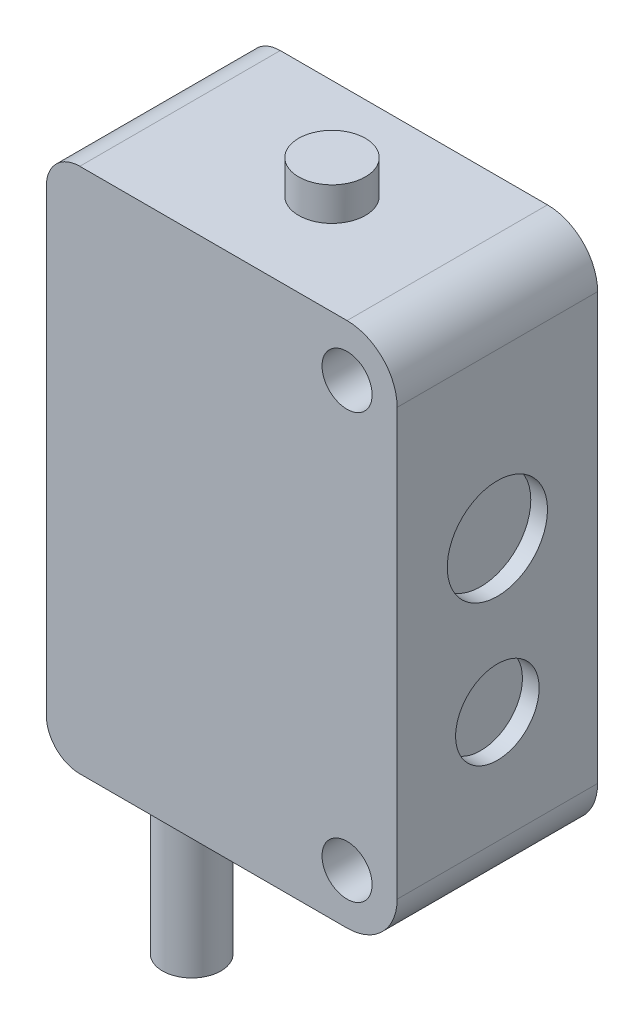
ISO-10303-21;
HEADER;
FILE_DESCRIPTION(('STEP AP214'),'2;1');
FILE_NAME('part.step','',(''),(''),'','','');
FILE_SCHEMA(('AUTOMOTIVE_DESIGN { 1 0 10303 214 1 1 1 1 }'));
ENDSEC;
DATA;
#1=APPLICATION_CONTEXT('core data for automotive mechanical design processes');
#2=APPLICATION_PROTOCOL_DEFINITION('international standard','automotive_design',2000,#1);
#3=PRODUCT_CONTEXT('',#1,'mechanical');
#4=PRODUCT('Part','Part','',(#3));
#5=PRODUCT_RELATED_PRODUCT_CATEGORY('part','',(#4));
#6=PRODUCT_DEFINITION_FORMATION('','',#4);
#7=PRODUCT_DEFINITION_CONTEXT('part definition',#1,'design');
#8=PRODUCT_DEFINITION('design','',#6,#7);
#9=PRODUCT_DEFINITION_SHAPE('','',#8);
#10=(LENGTH_UNIT() NAMED_UNIT(*) SI_UNIT(.MILLI.,.METRE.));
#11=(NAMED_UNIT(*) PLANE_ANGLE_UNIT() SI_UNIT($,.RADIAN.));
#12=(NAMED_UNIT(*) SI_UNIT($,.STERADIAN.) SOLID_ANGLE_UNIT());
#13=UNCERTAINTY_MEASURE_WITH_UNIT(LENGTH_MEASURE(1.E-05),#10,'distance_accuracy_value','');
#14=(GEOMETRIC_REPRESENTATION_CONTEXT(3) GLOBAL_UNCERTAINTY_ASSIGNED_CONTEXT((#13)) GLOBAL_UNIT_ASSIGNED_CONTEXT((#10,
#11,#12)) REPRESENTATION_CONTEXT('',''));
#15=CARTESIAN_POINT('',(0.,0.,0.));
#16=DIRECTION('',(0.,0.,1.));
#17=DIRECTION('',(1.,0.,0.));
#18=AXIS2_PLACEMENT_3D('',#15,#16,#17);
#19=CARTESIAN_POINT('',(0.,0.,12.));
#20=DIRECTION('',(0.,0.,-1.));
#21=DIRECTION('',(-1.,0.,0.));
#22=AXIS2_PLACEMENT_3D('',#19,#20,#21);
#23=PLANE('',#22);
#24=DIRECTION('',(0.,-1.,0.));
#25=VECTOR('',#24,1.);
#26=CARTESIAN_POINT('',(0.,0.,12.));
#27=LINE('',#26,#25);
#28=CARTESIAN_POINT('',(0.,29.5,12.));
#29=VERTEX_POINT('',#28);
#30=CARTESIAN_POINT('',(0.,2.,12.));
#31=VERTEX_POINT('',#30);
#32=EDGE_CURVE('E241',#29,#31,#27,.T.);
#33=ORIENTED_EDGE('',*,*,#32,.T.);
#34=CARTESIAN_POINT('',(2.,2.,12.));
#35=DIRECTION('',(0.,0.,-1.));
#36=DIRECTION('',(-1.,0.,0.));
#37=AXIS2_PLACEMENT_3D('',#34,#35,#36);
#38=CIRCLE('',#37,2.);
#39=CARTESIAN_POINT('',(2.,0.,12.));
#40=VERTEX_POINT('',#39);
#41=EDGE_CURVE('E49',#31,#40,#38,.F.);
#42=ORIENTED_EDGE('',*,*,#41,.T.);
#43=DIRECTION('',(1.,0.,0.));
#44=VECTOR('',#43,1.);
#45=CARTESIAN_POINT('',(0.,0.,12.));
#46=LINE('',#45,#44);
#47=CARTESIAN_POINT('',(18.,0.,12.));
#48=VERTEX_POINT('',#47);
#49=EDGE_CURVE('E155',#40,#48,#46,.T.);
#50=ORIENTED_EDGE('',*,*,#49,.T.);
#51=CARTESIAN_POINT('',(18.,3.,12.));
#52=DIRECTION('',(0.,0.,-1.));
#53=DIRECTION('',(-1.,0.,0.));
#54=AXIS2_PLACEMENT_3D('',#51,#52,#53);
#55=CIRCLE('',#54,3.);
#56=CARTESIAN_POINT('',(21.,3.,12.));
#57=VERTEX_POINT('',#56);
#58=EDGE_CURVE('E173',#48,#57,#55,.F.);
#59=ORIENTED_EDGE('',*,*,#58,.T.);
#60=DIRECTION('',(0.,1.,0.));
#61=VECTOR('',#60,1.);
#62=CARTESIAN_POINT('',(21.,0.,12.));
#63=LINE('',#62,#61);
#64=CARTESIAN_POINT('',(21.,28.5,12.));
#65=VERTEX_POINT('',#64);
#66=EDGE_CURVE('E140',#57,#65,#63,.T.);
#67=ORIENTED_EDGE('',*,*,#66,.T.);
#68=CARTESIAN_POINT('',(18.,28.5,12.));
#69=DIRECTION('',(0.,0.,-1.));
#70=DIRECTION('',(-1.,0.,0.));
#71=AXIS2_PLACEMENT_3D('',#68,#69,#70);
#72=CIRCLE('',#71,3.);
#73=CARTESIAN_POINT('',(18.,31.5,12.));
#74=VERTEX_POINT('',#73);
#75=EDGE_CURVE('E171',#65,#74,#72,.F.);
#76=ORIENTED_EDGE('',*,*,#75,.T.);
#77=DIRECTION('',(-1.,0.,0.));
#78=VECTOR('',#77,1.);
#79=CARTESIAN_POINT('',(0.,31.5,12.));
#80=LINE('',#79,#78);
#81=CARTESIAN_POINT('',(2.,31.5,12.));
#82=VERTEX_POINT('',#81);
#83=EDGE_CURVE('E243',#74,#82,#80,.T.);
#84=ORIENTED_EDGE('',*,*,#83,.T.);
#85=CARTESIAN_POINT('',(2.,29.5,12.));
#86=DIRECTION('',(0.,0.,-1.));
#87=DIRECTION('',(-1.,0.,0.));
#88=AXIS2_PLACEMENT_3D('',#85,#86,#87);
#89=CIRCLE('',#88,2.);
#90=EDGE_CURVE('E235',#82,#29,#89,.F.);
#91=ORIENTED_EDGE('',*,*,#90,.T.);
#92=EDGE_LOOP('',(#33,#42,#50,#59,#67,#76,#84,#91));
#93=FACE_BOUND('',#92,.T.);
#94=CARTESIAN_POINT('',(18.,28.4,12.));
#95=DIRECTION('',(0.,0.,1.));
#96=DIRECTION('',(1.,0.,0.));
#97=AXIS2_PLACEMENT_3D('',#94,#95,#96);
#98=CIRCLE('',#97,1.5);
#99=CARTESIAN_POINT('',(19.5,28.4,12.));
#100=VERTEX_POINT('',#99);
#101=EDGE_CURVE('E147',#100,#100,#98,.T.);
#102=ORIENTED_EDGE('',*,*,#101,.F.);
#103=EDGE_LOOP('',(#102));
#104=FACE_BOUND('',#103,.T.);
#105=CARTESIAN_POINT('',(18.,3.,12.));
#106=DIRECTION('',(0.,0.,1.));
#107=DIRECTION('',(1.,0.,0.));
#108=AXIS2_PLACEMENT_3D('',#105,#106,#107);
#109=CIRCLE('',#108,1.5);
#110=CARTESIAN_POINT('',(19.5,3.,12.));
#111=VERTEX_POINT('',#110);
#112=EDGE_CURVE('E256',#111,#111,#109,.T.);
#113=ORIENTED_EDGE('',*,*,#112,.F.);
#114=EDGE_LOOP('',(#113));
#115=FACE_BOUND('',#114,.T.);
#116=ADVANCED_FACE('F35',(#93,#104,#115),#23,.F.);
#117=CARTESIAN_POINT('',(0.,0.,0.));
#118=DIRECTION('',(0.,0.,-1.));
#119=DIRECTION('',(-1.,0.,0.));
#120=AXIS2_PLACEMENT_3D('',#117,#118,#119);
#121=PLANE('',#120);
#122=CARTESIAN_POINT('',(18.,28.4,0.));
#123=DIRECTION('',(0.,0.,1.));
#124=DIRECTION('',(1.,0.,0.));
#125=AXIS2_PLACEMENT_3D('',#122,#123,#124);
#126=CIRCLE('',#125,1.5);
#127=CARTESIAN_POINT('',(19.5,28.4,0.));
#128=VERTEX_POINT('',#127);
#129=EDGE_CURVE('E152',#128,#128,#126,.T.);
#130=ORIENTED_EDGE('',*,*,#129,.T.);
#131=EDGE_LOOP('',(#130));
#132=FACE_BOUND('',#131,.T.);
#133=DIRECTION('',(1.,0.,0.));
#134=VECTOR('',#133,1.);
#135=CARTESIAN_POINT('',(0.,0.,0.));
#136=LINE('',#135,#134);
#137=CARTESIAN_POINT('',(2.,0.,0.));
#138=VERTEX_POINT('',#137);
#139=CARTESIAN_POINT('',(18.,0.,0.));
#140=VERTEX_POINT('',#139);
#141=EDGE_CURVE('E159',#138,#140,#136,.T.);
#142=ORIENTED_EDGE('',*,*,#141,.F.);
#143=CARTESIAN_POINT('',(2.,2.,0.));
#144=DIRECTION('',(0.,0.,-1.));
#145=DIRECTION('',(-1.,0.,0.));
#146=AXIS2_PLACEMENT_3D('',#143,#144,#145);
#147=CIRCLE('',#146,2.);
#148=CARTESIAN_POINT('',(0.,2.,0.));
#149=VERTEX_POINT('',#148);
#150=EDGE_CURVE('E185',#138,#149,#147,.T.);
#151=ORIENTED_EDGE('',*,*,#150,.T.);
#152=DIRECTION('',(0.,-1.,0.));
#153=VECTOR('',#152,1.);
#154=CARTESIAN_POINT('',(0.,0.,0.));
#155=LINE('',#154,#153);
#156=CARTESIAN_POINT('',(0.,29.5,0.));
#157=VERTEX_POINT('',#156);
#158=EDGE_CURVE('E149',#157,#149,#155,.T.);
#159=ORIENTED_EDGE('',*,*,#158,.F.);
#160=CARTESIAN_POINT('',(2.,29.5,0.));
#161=DIRECTION('',(0.,0.,-1.));
#162=DIRECTION('',(-1.,0.,0.));
#163=AXIS2_PLACEMENT_3D('',#160,#161,#162);
#164=CIRCLE('',#163,2.);
#165=CARTESIAN_POINT('',(2.,31.5,0.));
#166=VERTEX_POINT('',#165);
#167=EDGE_CURVE('E183',#157,#166,#164,.T.);
#168=ORIENTED_EDGE('',*,*,#167,.T.);
#169=DIRECTION('',(-1.,0.,0.));
#170=VECTOR('',#169,1.);
#171=CARTESIAN_POINT('',(0.,31.5,0.));
#172=LINE('',#171,#170);
#173=CARTESIAN_POINT('',(18.,31.5,0.));
#174=VERTEX_POINT('',#173);
#175=EDGE_CURVE('E146',#174,#166,#172,.T.);
#176=ORIENTED_EDGE('',*,*,#175,.F.);
#177=CARTESIAN_POINT('',(18.,28.5,0.));
#178=DIRECTION('',(0.,0.,-1.));
#179=DIRECTION('',(-1.,0.,0.));
#180=AXIS2_PLACEMENT_3D('',#177,#178,#179);
#181=CIRCLE('',#180,3.);
#182=CARTESIAN_POINT('',(21.,28.5,0.));
#183=VERTEX_POINT('',#182);
#184=EDGE_CURVE('E131',#174,#183,#181,.T.);
#185=ORIENTED_EDGE('',*,*,#184,.T.);
#186=DIRECTION('',(0.,1.,0.));
#187=VECTOR('',#186,1.);
#188=CARTESIAN_POINT('',(21.,0.,0.));
#189=LINE('',#188,#187);
#190=CARTESIAN_POINT('',(21.,3.,0.));
#191=VERTEX_POINT('',#190);
#192=EDGE_CURVE('E137',#191,#183,#189,.T.);
#193=ORIENTED_EDGE('',*,*,#192,.F.);
#194=CARTESIAN_POINT('',(18.,3.,0.));
#195=DIRECTION('',(0.,0.,-1.));
#196=DIRECTION('',(-1.,0.,0.));
#197=AXIS2_PLACEMENT_3D('',#194,#195,#196);
#198=CIRCLE('',#197,3.);
#199=EDGE_CURVE('E121',#191,#140,#198,.T.);
#200=ORIENTED_EDGE('',*,*,#199,.T.);
#201=EDGE_LOOP('',(#142,#151,#159,#168,#176,#185,#193,#200));
#202=FACE_BOUND('',#201,.T.);
#203=CARTESIAN_POINT('',(18.,3.,0.));
#204=DIRECTION('',(0.,0.,1.));
#205=DIRECTION('',(1.,0.,0.));
#206=AXIS2_PLACEMENT_3D('',#203,#204,#205);
#207=CIRCLE('',#206,1.5);
#208=CARTESIAN_POINT('',(19.5,3.,0.));
#209=VERTEX_POINT('',#208);
#210=EDGE_CURVE('E258',#209,#209,#207,.T.);
#211=ORIENTED_EDGE('',*,*,#210,.T.);
#212=EDGE_LOOP('',(#211));
#213=FACE_BOUND('',#212,.T.);
#214=ADVANCED_FACE('F143',(#132,#202,#213),#121,.T.);
#215=CARTESIAN_POINT('',(21.,0.,12.));
#216=DIRECTION('',(-1.,0.,0.));
#217=DIRECTION('',(0.,0.,1.));
#218=AXIS2_PLACEMENT_3D('',#215,#216,#217);
#219=PLANE('',#218);
#220=CARTESIAN_POINT('',(21.,18.7,6.));
#221=DIRECTION('',(1.,0.,0.));
#222=DIRECTION('',(0.,0.,-1.));
#223=AXIS2_PLACEMENT_3D('',#220,#221,#222);
#224=CIRCLE('',#223,3.);
#225=CARTESIAN_POINT('',(21.,18.7,3.));
#226=VERTEX_POINT('',#225);
#227=EDGE_CURVE('E273',#226,#226,#224,.T.);
#228=ORIENTED_EDGE('',*,*,#227,.F.);
#229=EDGE_LOOP('',(#228));
#230=FACE_BOUND('',#229,.T.);
#231=CARTESIAN_POINT('',(21.,9.7,6.));
#232=DIRECTION('',(1.,0.,0.));
#233=DIRECTION('',(0.,0.,-1.));
#234=AXIS2_PLACEMENT_3D('',#231,#232,#233);
#235=CIRCLE('',#234,2.5);
#236=CARTESIAN_POINT('',(21.,9.7,3.5));
#237=VERTEX_POINT('',#236);
#238=EDGE_CURVE('E267',#237,#237,#235,.T.);
#239=ORIENTED_EDGE('',*,*,#238,.F.);
#240=EDGE_LOOP('',(#239));
#241=FACE_BOUND('',#240,.T.);
#242=ORIENTED_EDGE('',*,*,#66,.F.);
#243=DIRECTION('',(0.,0.,-1.));
#244=VECTOR('',#243,1.);
#245=CARTESIAN_POINT('',(21.,3.,12.));
#246=LINE('',#245,#244);
#247=EDGE_CURVE('E125',#57,#191,#246,.T.);
#248=ORIENTED_EDGE('',*,*,#247,.T.);
#249=ORIENTED_EDGE('',*,*,#192,.T.);
#250=DIRECTION('',(0.,0.,-1.));
#251=VECTOR('',#250,1.);
#252=CARTESIAN_POINT('',(21.,28.5,12.));
#253=LINE('',#252,#251);
#254=EDGE_CURVE('E141',#183,#65,#253,.F.);
#255=ORIENTED_EDGE('',*,*,#254,.T.);
#256=EDGE_LOOP('',(#242,#248,#249,#255));
#257=FACE_BOUND('',#256,.T.);
#258=ADVANCED_FACE('F136',(#230,#241,#257),#219,.F.);
#259=CARTESIAN_POINT('',(0.,31.5,12.));
#260=DIRECTION('',(0.,-1.,0.));
#261=DIRECTION('',(0.,0.,-1.));
#262=AXIS2_PLACEMENT_3D('',#259,#260,#261);
#263=PLANE('',#262);
#264=CARTESIAN_POINT('',(11.1,31.5,6.));
#265=DIRECTION('',(0.,-1.,0.));
#266=DIRECTION('',(0.,0.,-1.));
#267=AXIS2_PLACEMENT_3D('',#264,#265,#266);
#268=CIRCLE('',#267,2.);
#269=CARTESIAN_POINT('',(11.1,31.5,4.));
#270=VERTEX_POINT('',#269);
#271=EDGE_CURVE('E164',#270,#270,#268,.F.);
#272=ORIENTED_EDGE('',*,*,#271,.F.);
#273=EDGE_LOOP('',(#272));
#274=FACE_BOUND('',#273,.T.);
#275=ORIENTED_EDGE('',*,*,#175,.T.);
#276=DIRECTION('',(0.,0.,-1.));
#277=VECTOR('',#276,1.);
#278=CARTESIAN_POINT('',(2.,31.5,12.));
#279=LINE('',#278,#277);
#280=EDGE_CURVE('E11',#166,#82,#279,.F.);
#281=ORIENTED_EDGE('',*,*,#280,.T.);
#282=ORIENTED_EDGE('',*,*,#83,.F.);
#283=DIRECTION('',(0.,0.,-1.));
#284=VECTOR('',#283,1.);
#285=CARTESIAN_POINT('',(18.,31.5,12.));
#286=LINE('',#285,#284);
#287=EDGE_CURVE('E175',#74,#174,#286,.T.);
#288=ORIENTED_EDGE('',*,*,#287,.T.);
#289=EDGE_LOOP('',(#275,#281,#282,#288));
#290=FACE_BOUND('',#289,.T.);
#291=ADVANCED_FACE('F248',(#274,#290),#263,.F.);
#292=CARTESIAN_POINT('',(0.,0.,12.));
#293=DIRECTION('',(1.,0.,0.));
#294=DIRECTION('',(0.,0.,-1.));
#295=AXIS2_PLACEMENT_3D('',#292,#293,#294);
#296=PLANE('',#295);
#297=ORIENTED_EDGE('',*,*,#158,.T.);
#298=DIRECTION('',(0.,0.,-1.));
#299=VECTOR('',#298,1.);
#300=CARTESIAN_POINT('',(0.,2.,12.));
#301=LINE('',#300,#299);
#302=CARTESIAN_POINT('',(0.,2.,4.39609850676546));
#303=VERTEX_POINT('',#302);
#304=EDGE_CURVE('E63',#149,#303,#301,.F.);
#305=ORIENTED_EDGE('',*,*,#304,.T.);
#306=CARTESIAN_POINT('',(0.,1.93683512249513,8.13693880979573));
#307=CARTESIAN_POINT('',(0.,-0.162980398312273,7.62317124403445));
#308=CARTESIAN_POINT('',(2.15523306375944,0.,7.66304810068112));
#309=CARTESIAN_POINT('',(0.,1.95084203062787,8.0797382134936));
#310=CARTESIAN_POINT('',(0.,-0.149224251738284,7.62692735632381));
#311=CARTESIAN_POINT('',(2.14204816993278,0.,7.65870877024948));
#312=CARTESIAN_POINT('',(0.,1.96247152150819,8.0219686936225));
#313=CARTESIAN_POINT('',(0.,-0.134043421859367,7.62924692475699));
#314=CARTESIAN_POINT('',(2.12785936482586,0.,7.65390588171876));
#315=CARTESIAN_POINT('',(0.,1.98106174806458,7.90571413975154));
#316=CARTESIAN_POINT('',(0.,-0.10098777342364,7.62999862115966));
#317=CARTESIAN_POINT('',(2.09700608542803,0.,7.64291967770616));
#318=CARTESIAN_POINT('',(0.,1.98802507199702,7.84722952077024));
#319=CARTESIAN_POINT('',(0.,-0.0831562949717819,7.62846392259803));
#320=CARTESIAN_POINT('',(2.08034298986759,0.,7.63673713004285));
#321=CARTESIAN_POINT('',(0.,1.99730586191494,7.73088716262242));
#322=CARTESIAN_POINT('',(0.,-0.0452677011130535,7.62070634601689));
#323=CARTESIAN_POINT('',(2.0443641373133,0.,7.62265365957321));
#324=CARTESIAN_POINT('',(0.,1.99969932959627,7.67303537330214));
#325=CARTESIAN_POINT('',(0.,-0.0253038167997787,7.61461058769533));
#326=CARTESIAN_POINT('',(2.02509758731116,0.,7.61478331402946));
#327=CARTESIAN_POINT('',(0.,2.00024721882129,7.55731735269524));
#328=CARTESIAN_POINT('',(0.,0.0168424976905548,7.59682306955048));
#329=CARTESIAN_POINT('',(1.98312532283197,0.,7.59659591175098));
#330=CARTESIAN_POINT('',(0.,1.99840180947869,7.49945112207685));
#331=CARTESIAN_POINT('',(0.,0.0389692347504988,7.58520346365664));
#332=CARTESIAN_POINT('',(1.96041974559167,0.,7.58627895264076));
#333=CARTESIAN_POINT('',(0.,1.99135045805174,7.39331841843868));
#334=CARTESIAN_POINT('',(0.,0.0814143335320806,7.55761526044668));
#335=CARTESIAN_POINT('',(1.91488554674234,0.,7.56416965272015));
#336=CARTESIAN_POINT('',(0.,1.98673538166484,7.34501088267696));
#337=CARTESIAN_POINT('',(0.,0.101372507363181,7.54274307059891));
#338=CARTESIAN_POINT('',(1.89266902297064,0.,7.55288468434869));
#339=CARTESIAN_POINT('',(0.,1.97491507186992,7.24870958351748));
#340=CARTESIAN_POINT('',(0.,0.142336594281262,7.50748492721466));
#341=CARTESIAN_POINT('',(1.844869753425,0.,7.52708652995679));
#342=CARTESIAN_POINT('',(0.,1.96770947880233,7.20071586463165));
#343=CARTESIAN_POINT('',(0.,0.163302928340936,7.48718354114414));
#344=CARTESIAN_POINT('',(1.81928654054286,0.,7.5125728957848));
#345=CARTESIAN_POINT('',(0.,1.95088501107582,7.1045937690975));
#346=CARTESIAN_POINT('',(0.,0.206176737277261,7.43991630460445));
#347=CARTESIAN_POINT('',(1.76396034274313,0.,7.47898327196881));
#348=CARTESIAN_POINT('',(0.,1.94123952927082,7.05647010835317));
#349=CARTESIAN_POINT('',(0.,0.228053733574999,7.4129906710132));
#350=CARTESIAN_POINT('',(1.7341732100554,0.,7.45985709712815));
#351=CARTESIAN_POINT('',(0.,1.91995503473011,6.9607107998852));
#352=CARTESIAN_POINT('',(0.,0.272057086634414,7.35156003582039));
#353=CARTESIAN_POINT('',(1.67023016891106,0.,7.41548533626005));
#354=CARTESIAN_POINT('',(0.,1.90831757849187,6.91307480167924));
#355=CARTESIAN_POINT('',(0.,0.294144204413786,7.3172144742904));
#356=CARTESIAN_POINT('',(1.63607767671495,0.,7.39024452176878));
#357=CARTESIAN_POINT('',(0.,1.88689589873724,6.83104134047631));
#358=CARTESIAN_POINT('',(0.,0.332142065579762,7.25007110863834));
#359=CARTESIAN_POINT('',(1.57303034728235,0.,7.33925358153134));
#360=CARTESIAN_POINT('',(0.,1.87746266414338,6.79655057207412));
#361=CARTESIAN_POINT('',(0.,0.348035896113425,7.21955948637963));
#362=CARTESIAN_POINT('',(1.54521456016237,0.,7.3154905647449));
#363=CARTESIAN_POINT('',(0.,1.85805183757475,6.7277221403963));
#364=CARTESIAN_POINT('',(0.,0.37936999684075,7.15336199139034));
#365=CARTESIAN_POINT('',(1.48722326059413,0.,7.26223116729388));
#366=CARTESIAN_POINT('',(0.,1.84807422342467,6.69338448341939));
#367=CARTESIAN_POINT('',(0.,0.394803966414087,7.11775993626065));
#368=CARTESIAN_POINT('',(1.45704765199682,0.,7.23273455294559));
#369=CARTESIAN_POINT('',(0.,1.82786373644973,6.62466598326665));
#370=CARTESIAN_POINT('',(0.,0.424929693634334,7.04073060673822));
#371=CARTESIAN_POINT('',(1.39461887657728,0.,7.16643125013527));
#372=CARTESIAN_POINT('',(0.,1.81763014879354,6.59028535367346));
#373=CARTESIAN_POINT('',(0.,0.439620832385237,6.99937326510576));
#374=CARTESIAN_POINT('',(1.36235936885051,0.,7.12960146499481));
#375=CARTESIAN_POINT('',(0.,1.79735812090225,6.52146447483049));
#376=CARTESIAN_POINT('',(0.,0.467795368528807,6.91040621042014));
#377=CARTESIAN_POINT('',(1.29673848011059,0.,7.0469681751789));
#378=CARTESIAN_POINT('',(0.,1.78731968642384,6.48702422385452));
#379=CARTESIAN_POINT('',(0.,0.481290854241388,6.86288020507471));
#380=CARTESIAN_POINT('',(1.26337706667127,0.,7.00116440622685));
#381=CARTESIAN_POINT('',(0.,1.7682491471883,6.41888484445113));
#382=CARTESIAN_POINT('',(0.,0.506224366042147,6.76259816149166));
#383=CARTESIAN_POINT('',(1.19815291700798,0.,6.90025533941929));
#384=CARTESIAN_POINT('',(0.,1.75919692671913,6.3851914652251));
#385=CARTESIAN_POINT('',(0.,0.51772874518155,6.71009119172052));
#386=CARTESIAN_POINT('',(1.16627422153017,0.,6.84544133864956));
#387=CARTESIAN_POINT('',(0.,1.74242172812538,6.31746359126593));
#388=CARTESIAN_POINT('',(0.,0.538565779985405,6.59882255356499));
#389=CARTESIAN_POINT('',(1.10560715938834,0.,6.72455035028512));
#390=CARTESIAN_POINT('',(0.,1.73469883898704,6.28342907385803));
#391=CARTESIAN_POINT('',(0.,0.54793399556314,6.54005697070651));
#392=CARTESIAN_POINT('',(1.07681899965516,0.,6.65847260927765));
#393=CARTESIAN_POINT('',(0.,1.72136475332657,6.21518684770821));
#394=CARTESIAN_POINT('',(0.,0.563826085879989,6.41739152662941));
#395=CARTESIAN_POINT('',(1.02605303486045,0.,6.51581351190814));
#396=CARTESIAN_POINT('',(0.,1.71573883221106,6.1809821240779));
#397=CARTESIAN_POINT('',(0.,0.57041119974274,6.35344040914854));
#398=CARTESIAN_POINT('',(1.00402794096692,0.,6.43931075348337));
#399=CARTESIAN_POINT('',(0.,1.70722168049796,6.1122362354827));
#400=CARTESIAN_POINT('',(0.,0.58027003759696,6.22178147193234));
#401=CARTESIAN_POINT('',(0.970300622961627,0.,6.27816764360119));
#402=CARTESIAN_POINT('',(0.,1.70432904987519,6.07769525192454));
#403=CARTESIAN_POINT('',(0.,0.583580862240164,6.15386982749307));
#404=CARTESIAN_POINT('',(0.95859311426237,0.,6.19353148267578));
#405=CARTESIAN_POINT('',(0.,1.70167227842998,6.00740549182217));
#406=CARTESIAN_POINT('',(0.,0.586611140832069,6.01489077298947));
#407=CARTESIAN_POINT('',(0.947854465277183,0.,6.01882915390054));
#408=CARTESIAN_POINT('',(0.,1.70200863570395,5.97165267675082));
#409=CARTESIAN_POINT('',(0.,0.586228790317255,5.9434779179584));
#410=CARTESIAN_POINT('',(0.949230521684976,0.,5.92867595480163));
#411=CARTESIAN_POINT('',(0.,1.70599629972429,5.90032930163099));
#412=CARTESIAN_POINT('',(0.,0.581672706900767,5.80297215830144));
#413=CARTESIAN_POINT('',(0.965311036193036,0.,5.75260869788773));
#414=CARTESIAN_POINT('',(0.,1.70964886083145,5.86475881566916));
#415=CARTESIAN_POINT('',(0.,0.577477446229539,5.73357709858112));
#416=CARTESIAN_POINT('',(0.98002053769249,0.,5.66669625711421));
#417=CARTESIAN_POINT('',(0.,1.71973621907862,5.79378076988645));
#418=CARTESIAN_POINT('',(0.,0.565735183040633,5.59928350702655));
#419=CARTESIAN_POINT('',(1.01965646820749,0.,5.50396395482519));
#420=CARTESIAN_POINT('',(0.,1.72619019383172,5.75837606475882));
#421=CARTESIAN_POINT('',(0.,0.558122434964903,5.53422134449718));
#422=CARTESIAN_POINT('',(1.0446532585134,0.,5.42721150243259));
#423=CARTESIAN_POINT('',(0.,1.74107651932383,5.68799352373587));
#424=CARTESIAN_POINT('',(0.,0.540201268821402,5.41045177047054));
#425=CARTESIAN_POINT('',(1.10059713590041,0.,5.28569680829759));
#426=CARTESIAN_POINT('',(0.,1.74950926787565,5.65301577516542));
#427=CARTESIAN_POINT('',(0.,0.529846641631659,5.351671400253));
#428=CARTESIAN_POINT('',(1.13154541924394,0.,5.22093698224363));
#429=CARTESIAN_POINT('',(0.,1.76784903467589,5.58231148656669));
#430=CARTESIAN_POINT('',(0.,0.506731600074812,5.23906283635057));
#431=CARTESIAN_POINT('',(1.19677621931281,0.,5.1013273314207));
#432=CARTESIAN_POINT('',(0.,1.77779333896229,5.54659488644956));
#433=CARTESIAN_POINT('',(0.,0.493873129836717,5.18548243753857));
#434=CARTESIAN_POINT('',(1.23113188917113,0.,5.04684239807566));
#435=CARTESIAN_POINT('',(0.,1.79824737418952,5.47533221186889));
#436=CARTESIAN_POINT('',(0.,0.466577035409689,5.08513894931369));
#437=CARTESIAN_POINT('',(1.29970218945688,0.,4.94869086102796));
#438=CARTESIAN_POINT('',(0.,1.80875703806014,5.4397861177203));
#439=CARTESIAN_POINT('',(0.,0.452116881248533,5.03845177503942));
#440=CARTESIAN_POINT('',(1.3339168360981,0.,4.90502297749775));
#441=CARTESIAN_POINT('',(0.,1.82976726092098,5.36880124222331));
#442=CARTESIAN_POINT('',(0.,0.422148104626759,4.95148497309558));
#443=CARTESIAN_POINT('',(1.40062320136226,0.,4.82664653025497));
#444=CARTESIAN_POINT('',(0.,1.84026776061726,5.33336244352801));
#445=CARTESIAN_POINT('',(0.,0.406633765201929,4.91128244009376));
#446=CARTESIAN_POINT('',(1.43311954875333,0.,4.79191280808474));
#447=CARTESIAN_POINT('',(0.,1.86087610170912,5.26236955840362));
#448=CARTESIAN_POINT('',(0.,0.374915361611927,4.83654358205906));
#449=CARTESIAN_POINT('',(1.49577625058735,0.,4.72944965700669));
#450=CARTESIAN_POINT('',(0.,1.87098394177592,5.22681547158483));
#451=CARTESIAN_POINT('',(0.,0.358713765974144,4.80210429954662));
#452=CARTESIAN_POINT('',(1.52593659712543,0.,4.70172025180033));
#453=CARTESIAN_POINT('',(0.,1.89122002473941,5.15283062842983));
#454=CARTESIAN_POINT('',(0.,0.324702679293544,4.73589801423996));
#455=CARTESIAN_POINT('',(1.58583029326059,0.,4.6498844343611));
#456=CARTESIAN_POINT('',(0.,1.90129274059407,5.11438444348386));
#457=CARTESIAN_POINT('',(0.,0.306891836067001,4.70466376273219));
#458=CARTESIAN_POINT('',(1.61536130202728,0.,4.62620676804727));
#459=CARTESIAN_POINT('',(0.,1.9203090792233,5.03721464729545));
#460=CARTESIAN_POINT('',(0.,0.271186736073723,4.64744355508599));
#461=CARTESIAN_POINT('',(1.67142807696692,0.,4.58375006536131));
#462=CARTESIAN_POINT('',(0.,1.92925270995505,4.99849103801018));
#463=CARTESIAN_POINT('',(0.,0.2533105938768,4.62155136607571));
#464=CARTESIAN_POINT('',(1.69796386424836,0.,4.56497099446564));
#465=CARTESIAN_POINT('',(0.,1.95403189602507,4.88180474047281));
#466=CARTESIAN_POINT('',(0.,0.199658678866084,4.55039604527521));
#467=CARTESIAN_POINT('',(1.77338065321428,0.,4.51419451684044));
#468=CARTESIAN_POINT('',(0.,1.96780013236835,4.8033808517092));
#469=CARTESIAN_POINT('',(0.,0.16460693095442,4.5129468378554));
#470=CARTESIAN_POINT('',(1.81802744890627,0.,4.48779240452168));
#471=CARTESIAN_POINT('',(0.,1.98825038943551,4.64703287166735));
#472=CARTESIAN_POINT('',(0.,0.0975624141781289,4.45301897587556));
#473=CARTESIAN_POINT('',(1.89735682975292,0.,4.44429741920541));
#474=CARTESIAN_POINT('',(0.,1.99505580149966,4.5691252994402));
#475=CARTESIAN_POINT('',(0.,0.0656842085043797,4.43064647856732));
#476=CARTESIAN_POINT('',(1.93220468594962,0.,4.42704515324868));
#477=CARTESIAN_POINT('',(0.,2.0011914878479,4.4130247453427));
#478=CARTESIAN_POINT('',(0.,0.00537854042024259,4.39691532209747));
#479=CARTESIAN_POINT('',(1.99489648632608,0.,4.39796365849501));
#480=CARTESIAN_POINT('',(0.,2.00052534947153,4.33483191845947));
#481=CARTESIAN_POINT('',(0.,-0.0229028643331489,4.38577576184849));
#482=CARTESIAN_POINT('',(2.0227437851399,0.,4.3861318300061));
#483=CARTESIAN_POINT('',(0.,1.99233851747381,4.19766660000934));
#484=CARTESIAN_POINT('',(0.,-0.0689231993130274,4.37374650690942));
#485=CARTESIAN_POINT('',(2.06693282823495,0.,4.36839412917208));
#486=CARTESIAN_POINT('',(0.,1.98650323077037,4.13859010264806));
#487=CARTESIAN_POINT('',(0.,-0.0875542900308317,4.3710893129277));
#488=CARTESIAN_POINT('',(2.0844313948271,0.,4.36174747469907));
#489=CARTESIAN_POINT('',(0.,1.97011091234765,4.02109843928029));
#490=CARTESIAN_POINT('',(0.,-0.122190478282109,4.36984014103016));
#491=CARTESIAN_POINT('',(2.11680389507901,0.,4.34994548830187));
#492=CARTESIAN_POINT('',(0.,1.95955464000915,3.96268316846287));
#493=CARTESIAN_POINT('',(0.,-0.138151274565492,4.37128322764624));
#494=CARTESIAN_POINT('',(2.13167825031248,0.,4.3447899167533));
#495=CARTESIAN_POINT('',(0.,1.93334699341654,3.84551487451842));
#496=CARTESIAN_POINT('',(0.,-0.167677351036985,4.37748283634278));
#497=CARTESIAN_POINT('',(2.15957711617309,0.,4.33546829863984));
#498=CARTESIAN_POINT('',(0.,1.91757834863925,3.78678797030475));
#499=CARTESIAN_POINT('',(0.,-0.181133528326475,4.3823403631083));
#500=CARTESIAN_POINT('',(2.17254806474417,0.,4.33132925877363));
#501=CARTESIAN_POINT('',(0.,1.88104075739081,3.67087293151112));
#502=CARTESIAN_POINT('',(0.,-0.205111495053921,4.39470977606579));
#503=CARTESIAN_POINT('',(2.19656597611647,0.,4.32393246636724));
#504=CARTESIAN_POINT('',(0.,1.86026875212785,3.61368576211343));
#505=CARTESIAN_POINT('',(0.,-0.215599774810105,4.40223471502393));
#506=CARTESIAN_POINT('',(2.20761175482251,0.,4.32067525552828));
#507=CARTESIAN_POINT('',(0.,1.8370125544413,3.55751568007145));
#508=CARTESIAN_POINT('',(0.,-0.224580477662192,4.4106621867715));
#509=CARTESIAN_POINT('',(2.21787081559259,0.,4.31772432415414));
#510=(BOUNDED_SURFACE() B_SPLINE_SURFACE(3,2,((#306,#307,#308),(#309,#310,#311),(#312,#313,
#314),(#315,#316,#317),(#318,#319,#320),(#321,#322,#323),(#324,#325,#326),(#327,#328,#329),
(#330,#331,#332),(#333,#334,#335),(#336,#337,#338),(#339,#340,#341),(#342,#343,#344),(#345,#346,
#347),(#348,#349,#350),(#351,#352,#353),(#354,#355,#356),(#357,#358,#359),(#360,#361,#362),
(#363,#364,#365),(#366,#367,#368),(#369,#370,#371),(#372,#373,#374),(#375,#376,#377),(#378,#379,
#380),(#381,#382,#383),(#384,#385,#386),(#387,#388,#389),(#390,#391,#392),(#393,#394,#395),
(#396,#397,#398),(#399,#400,#401),(#402,#403,#404),(#405,#406,#407),(#408,#409,#410),(#411,#412,
#413),(#414,#415,#416),(#417,#418,#419),(#420,#421,#422),(#423,#424,#425),(#426,#427,#428),
(#429,#430,#431),(#432,#433,#434),(#435,#436,#437),(#438,#439,#440),(#441,#442,#443),(#444,#445,
#446),(#447,#448,#449),(#450,#451,#452),(#453,#454,#455),(#456,#457,#458),(#459,#460,#461),
(#462,#463,#464),(#465,#466,#467),(#468,#469,#470),(#471,#472,#473),(#474,#475,#476),(#477,#478,
#479),(#480,#481,#482),(#483,#484,#485),(#486,#487,#488),(#489,#490,#491),(#492,#493,#494),
(#495,#496,#497),(#498,#499,#500),(#501,#502,#503),(#504,#505,#506),(#507,#508,#509)),
.UNSPECIFIED.,.F.,.F.,.F.) B_SPLINE_SURFACE_WITH_KNOTS((4,2,2,2,2,2,2,2,2,2,2,2,2,2,2,2,2,2,2,2,
2,2,2,2,2,2,2,2,2,2,2,2,2,4),(3,3),(0.,0.176603187605436,0.353108334670628,0.52665153128839,
0.700187804368461,0.845697652158235,0.991227709905511,1.13841889240532,1.28549558272602,
1.39276245611055,1.50003370227821,1.60764831414441,1.71526609565064,1.81991650674638,
1.92457392048185,2.02848194567113,2.1323367189885,2.23943406528053,2.34657193824519,
2.45445510586539,2.56235998093418,2.67357457387247,2.78477600207938,2.8956607731785,
3.00654591948829,3.12576231325239,3.24497786679925,3.48357805939761,3.7178725731824,
3.95205459920643,4.12996948205461,4.30785575719591,4.4900527491142,4.67236141067852),(0.,1.),
.UNSPECIFIED.) GEOMETRIC_REPRESENTATION_ITEM() RATIONAL_B_SPLINE_SURFACE(((1.,0.679110988027834,
1.),(1.,0.681536831015853,1.),(1.,0.684136435062991,1.),(1.,0.689751214801625,1.),(1.,
0.692766158989051,1.),(1.,0.699227534319707,1.),(1.,0.702665875613097,1.),(1.,0.710093320047455,
1.),(1.,0.714082401210205,1.),(1.,0.722005288115136,1.),(1.,0.725843974371542,1.),(1.,
0.734029517341827,1.),(1.,0.738376444561781,1.),(1.,0.747684308318842,1.),(1.,0.752651687001265,
1.),(1.,0.763197352512859,1.),(1.,0.768775161143639,1.),(1.,0.778948507952136,1.),(1.,
0.783401266585304,1.),(1.,0.792600348140823,1.),(1.,0.797346683023056,1.),(1.,0.807074313933831,
1.),(1.,0.812056313421919,1.),(1.,0.822095171451195,1.),(1.,0.827152032192931,1.),(1.,
0.8369498370198,1.),(1.,0.841695647302444,1.),(1.,0.850657539691298,1.),(1.,0.854873586329713,
1.),(1.,0.862264725273913,1.),(1.,0.865447055063051,1.),(1.,0.870305150085598,1.),(1.,
0.871981686583146,1.),(1.,0.873520025061916,1.),(1.,0.87332353273639,1.),(1.,0.871018526725985,
1.),(1.,0.86890928954185,1.),(1.,0.863188136243524,1.),(1.,0.859565868952381,1.),(1.,
0.851391407761836,1.),(1.,0.846839026896171,1.),(1.,0.837155986424857,1.),(1.,0.832011872439257,
1.),(1.,0.821645577171098,1.),(1.,0.816423405201626,1.),(1.,0.80614553945238,1.),(1.,
0.801089413955092,1.),(1.,0.791252289427072,1.),(1.,0.786471291327369,1.),(1.,0.776895806544934,
1.),(1.,0.772127295727481,1.),(1.,0.762996578917011,1.),(1.,0.758634370060663,1.),(1.,
0.746139909424696,1.),(1.,0.738606859229698,1.),(1.,0.725055630307194,1.),(1.,0.719012567930439,
1.),(1.,0.708029622735187,1.),(1.,0.703089211659202,1.),(1.,0.695182204434037,1.),(1.,
0.692026568477121,1.),(1.,0.686154245148741,1.),(1.,0.683437487278417,1.),(1.,0.678315912786213,
1.),(1.,0.675920250817536,1.),(1.,0.671463502713252,1.),(1.,0.669402622541149,1.),(1.,
0.667482056763965,1.))) REPRESENTATION_ITEM('') SURFACE());
#511=CARTESIAN_POINT('',(0.,1.8370125544413,3.55751568007145));
#512=CARTESIAN_POINT('',(0.,1.86026875212785,3.61368576211343));
#513=CARTESIAN_POINT('',(0.,1.88104075739081,3.67087293151112));
#514=CARTESIAN_POINT('',(0.,1.91757834863925,3.78678797030475));
#515=CARTESIAN_POINT('',(0.,1.93334699341654,3.84551487451842));
#516=CARTESIAN_POINT('',(0.,1.95955464000915,3.96268316846287));
#517=CARTESIAN_POINT('',(0.,1.97011091234765,4.02109843928029));
#518=CARTESIAN_POINT('',(0.,1.98650323077037,4.13859010264806));
#519=CARTESIAN_POINT('',(0.,1.99233851747381,4.19766660000934));
#520=CARTESIAN_POINT('',(0.,2.00052534947153,4.33483191845947));
#521=CARTESIAN_POINT('',(0.,2.0011914878479,4.4130247453427));
#522=CARTESIAN_POINT('',(0.,1.99505580149966,4.5691252994402));
#523=CARTESIAN_POINT('',(0.,1.98825038943551,4.64703287166735));
#524=CARTESIAN_POINT('',(0.,1.96780013236835,4.8033808517092));
#525=CARTESIAN_POINT('',(0.,1.95403189602507,4.88180474047281));
#526=CARTESIAN_POINT('',(0.,1.92925270995505,4.99849103801018));
#527=CARTESIAN_POINT('',(0.,1.9203090792233,5.03721464729546));
#528=CARTESIAN_POINT('',(0.,1.90129274059407,5.11438444348386));
#529=CARTESIAN_POINT('',(0.,1.89122002473941,5.15283062842983));
#530=CARTESIAN_POINT('',(0.,1.87098394177592,5.22681547158483));
#531=CARTESIAN_POINT('',(0.,1.86087610170912,5.26236955840362));
#532=CARTESIAN_POINT('',(0.,1.84026776061726,5.33336244352801));
#533=CARTESIAN_POINT('',(0.,1.82976726092098,5.36880124222331));
#534=CARTESIAN_POINT('',(0.,1.80875703806014,5.4397861177203));
#535=CARTESIAN_POINT('',(0.,1.79824737418952,5.47533221186889));
#536=CARTESIAN_POINT('',(0.,1.77779333896229,5.54659488644956));
#537=CARTESIAN_POINT('',(0.,1.76784903467589,5.58231148656669));
#538=CARTESIAN_POINT('',(0.,1.74950926787565,5.65301577516542));
#539=CARTESIAN_POINT('',(0.,1.74107651932383,5.68799352373587));
#540=CARTESIAN_POINT('',(0.,1.72619019383172,5.75837606475882));
#541=CARTESIAN_POINT('',(0.,1.71973621907862,5.79378076988645));
#542=CARTESIAN_POINT('',(0.,1.70964886083145,5.86475881566916));
#543=CARTESIAN_POINT('',(0.,1.70599629972429,5.90032930163099));
#544=CARTESIAN_POINT('',(0.,1.70200863570395,5.97165267675082));
#545=CARTESIAN_POINT('',(0.,1.70167227842998,6.00740549182217));
#546=CARTESIAN_POINT('',(0.,1.70432904987519,6.07769525192454));
#547=CARTESIAN_POINT('',(0.,1.70722168049796,6.1122362354827));
#548=CARTESIAN_POINT('',(0.,1.71573883221106,6.1809821240779));
#549=CARTESIAN_POINT('',(0.,1.72136475332657,6.21518684770821));
#550=CARTESIAN_POINT('',(0.,1.73469883898704,6.28342907385803));
#551=CARTESIAN_POINT('',(0.,1.74242172812538,6.31746359126593));
#552=CARTESIAN_POINT('',(0.,1.75919692671913,6.3851914652251));
#553=CARTESIAN_POINT('',(0.,1.7682491471883,6.41888484445113));
#554=CARTESIAN_POINT('',(0.,1.78731968642384,6.48702422385452));
#555=CARTESIAN_POINT('',(0.,1.79735812090225,6.52146447483049));
#556=CARTESIAN_POINT('',(0.,1.81763014879354,6.59028535367346));
#557=CARTESIAN_POINT('',(0.,1.82786373644973,6.62466598326665));
#558=CARTESIAN_POINT('',(0.,1.84807422342467,6.69338448341939));
#559=CARTESIAN_POINT('',(0.,1.85805183757475,6.7277221403963));
#560=CARTESIAN_POINT('',(0.,1.87746266414338,6.79655057207412));
#561=CARTESIAN_POINT('',(0.,1.88689589873724,6.83104134047631));
#562=CARTESIAN_POINT('',(0.,1.90831757849187,6.91307480167924));
#563=CARTESIAN_POINT('',(0.,1.91995503473011,6.9607107998852));
#564=CARTESIAN_POINT('',(0.,1.94123952927082,7.05647010835317));
#565=CARTESIAN_POINT('',(0.,1.95088501107582,7.1045937690975));
#566=CARTESIAN_POINT('',(0.,1.96770947880233,7.20071586463165));
#567=CARTESIAN_POINT('',(0.,1.97491507186992,7.24870958351748));
#568=CARTESIAN_POINT('',(0.,1.98673538166484,7.34501088267696));
#569=CARTESIAN_POINT('',(0.,1.99135045805174,7.39331841843868));
#570=CARTESIAN_POINT('',(0.,1.99840180947869,7.49945112207685));
#571=CARTESIAN_POINT('',(0.,2.00024721882129,7.55731735269524));
#572=CARTESIAN_POINT('',(0.,1.99969932959627,7.67303537330214));
#573=CARTESIAN_POINT('',(0.,1.99730586191494,7.73088716262242));
#574=CARTESIAN_POINT('',(0.,1.98802507199702,7.84722952077024));
#575=CARTESIAN_POINT('',(0.,1.98106174806458,7.90571413975154));
#576=CARTESIAN_POINT('',(0.,1.96247152150819,8.02196869362251));
#577=CARTESIAN_POINT('',(0.,1.95084203062787,8.0797382134936));
#578=CARTESIAN_POINT('',(0.,1.93683512249513,8.13693880979573));
#579=B_SPLINE_CURVE_WITH_KNOTS('',3,(#511,#512,#513,#514,#515,#516,#517,#518,#519,#520,#521,
#522,#523,#524,#525,#526,#527,#528,#529,#530,#531,#532,#533,#534,#535,#536,#537,#538,#539,#540,
#541,#542,#543,#544,#545,#546,#547,#548,#549,#550,#551,#552,#553,#554,#555,#556,#557,#558,#559,
#560,#561,#562,#563,#564,#565,#566,#567,#568,#569,#570,#571,#572,#573,#574,#575,#576,#577,#578),
.UNSPECIFIED.,.F.,.F.,(4,2,2,2,2,2,2,2,2,2,2,2,2,2,2,2,2,2,2,2,2,2,2,2,2,2,2,2,2,2,2,2,2,4),(0.,
0.182308661564322,0.364505653482615,0.542391928623909,0.720306811472092,0.954488837496125,
1.18878335128091,1.42738354387927,1.54659909742613,1.66581549119023,1.77670063750002,
1.88758540859914,1.99878683680605,2.11000142974434,2.21790630481313,2.32578947243333,
2.43292734539799,2.54002469169002,2.64387946500739,2.74778749019667,2.85244490393214,
2.95709531502788,3.06471309653411,3.17232770840031,3.27959895456798,3.3868658279525,
3.5339425182732,3.68113370077301,3.82666375852029,3.97217360631006,4.14570987939013,
4.31925307600789,4.49575822307308,4.67236141067852),.UNSPECIFIED.);
#580=CARTESIAN_POINT('',(0.,2.,7.60390149323455));
#581=VERTEX_POINT('',#580);
#582=EDGE_CURVE('E192',#303,#581,#579,.T.);
#583=ORIENTED_EDGE('',*,*,#582,.T.);
#584=DIRECTION('',(0.,0.,-1.));
#585=VECTOR('',#584,1.);
#586=CARTESIAN_POINT('',(0.,2.,12.));
#587=LINE('',#586,#585);
#588=EDGE_CURVE('E190',#581,#31,#587,.F.);
#589=ORIENTED_EDGE('',*,*,#588,.T.);
#590=ORIENTED_EDGE('',*,*,#32,.F.);
#591=DIRECTION('',(0.,0.,-1.));
#592=VECTOR('',#591,1.);
#593=CARTESIAN_POINT('',(0.,29.5,12.));
#594=LINE('',#593,#592);
#595=EDGE_CURVE('E187',#29,#157,#594,.T.);
#596=ORIENTED_EDGE('',*,*,#595,.T.);
#597=EDGE_LOOP('',(#297,#305,#583,#589,#590,#596));
#598=FACE_BOUND('',#597,.T.);
#599=ADVANCED_FACE('F200',(#598),#296,.F.);
#600=CARTESIAN_POINT('',(0.,0.,12.));
#601=DIRECTION('',(0.,1.,0.));
#602=DIRECTION('',(0.,0.,1.));
#603=AXIS2_PLACEMENT_3D('',#600,#601,#602);
#604=PLANE('',#603);
#605=ORIENTED_EDGE('',*,*,#49,.F.);
#606=DIRECTION('',(0.,0.,-1.));
#607=VECTOR('',#606,1.);
#608=CARTESIAN_POINT('',(2.,0.,12.));
#609=LINE('',#608,#607);
#610=CARTESIAN_POINT('',(2.,0.,7.60390149323455));
#611=VERTEX_POINT('',#610);
#612=EDGE_CURVE('E180',#40,#611,#609,.T.);
#613=ORIENTED_EDGE('',*,*,#612,.T.);
#614=CARTESIAN_POINT('',(2.7,0.,6.00000000000001));
#615=DIRECTION('',(0.,1.,0.));
#616=DIRECTION('',(0.,0.,1.));
#617=AXIS2_PLACEMENT_3D('',#614,#615,#616);
#618=CIRCLE('',#617,1.75);
#619=CARTESIAN_POINT('',(2.,0.,4.39609850676546));
#620=VERTEX_POINT('',#619);
#621=EDGE_CURVE('E165',#620,#611,#618,.F.);
#622=ORIENTED_EDGE('',*,*,#621,.F.);
#623=DIRECTION('',(0.,0.,-1.));
#624=VECTOR('',#623,1.);
#625=CARTESIAN_POINT('',(2.,0.,12.));
#626=LINE('',#625,#624);
#627=EDGE_CURVE('E178',#620,#138,#626,.T.);
#628=ORIENTED_EDGE('',*,*,#627,.T.);
#629=ORIENTED_EDGE('',*,*,#141,.T.);
#630=DIRECTION('',(0.,0.,-1.));
#631=VECTOR('',#630,1.);
#632=CARTESIAN_POINT('',(18.,0.,12.));
#633=LINE('',#632,#631);
#634=EDGE_CURVE('E127',#140,#48,#633,.F.);
#635=ORIENTED_EDGE('',*,*,#634,.T.);
#636=EDGE_LOOP('',(#605,#613,#622,#628,#629,#635));
#637=FACE_BOUND('',#636,.T.);
#638=ADVANCED_FACE('F220',(#637),#604,.F.);
#639=CARTESIAN_POINT('',(18.,28.4,12.));
#640=DIRECTION('',(0.,0.,-1.));
#641=DIRECTION('',(-1.,0.,0.));
#642=AXIS2_PLACEMENT_3D('',#639,#640,#641);
#643=CYLINDRICAL_SURFACE('',#642,1.5);
#644=ORIENTED_EDGE('',*,*,#101,.T.);
#645=EDGE_LOOP('',(#644));
#646=FACE_BOUND('',#645,.T.);
#647=ORIENTED_EDGE('',*,*,#129,.F.);
#648=EDGE_LOOP('',(#647));
#649=FACE_BOUND('',#648,.T.);
#650=ADVANCED_FACE('F305',(#646,#649),#643,.F.);
#651=CARTESIAN_POINT('',(18.,3.,12.));
#652=DIRECTION('',(0.,0.,-1.));
#653=DIRECTION('',(-1.,0.,0.));
#654=AXIS2_PLACEMENT_3D('',#651,#652,#653);
#655=CYLINDRICAL_SURFACE('',#654,1.5);
#656=ORIENTED_EDGE('',*,*,#112,.T.);
#657=EDGE_LOOP('',(#656));
#658=FACE_BOUND('',#657,.T.);
#659=ORIENTED_EDGE('',*,*,#210,.F.);
#660=EDGE_LOOP('',(#659));
#661=FACE_BOUND('',#660,.T.);
#662=ADVANCED_FACE('F307',(#658,#661),#655,.F.);
#663=CARTESIAN_POINT('',(2.7,-12.,6.00000000000001));
#664=DIRECTION('',(0.,1.,0.));
#665=DIRECTION('',(0.,0.,1.));
#666=AXIS2_PLACEMENT_3D('',#663,#664,#665);
#667=CYLINDRICAL_SURFACE('',#666,1.75);
#668=CARTESIAN_POINT('',(2.7,-12.,6.00000000000001));
#669=DIRECTION('',(0.,-1.,0.));
#670=DIRECTION('',(0.,0.,-1.));
#671=AXIS2_PLACEMENT_3D('',#668,#669,#670);
#672=CIRCLE('',#671,1.75);
#673=CARTESIAN_POINT('',(2.7,-12.,4.25));
#674=VERTEX_POINT('',#673);
#675=EDGE_CURVE('E261',#674,#674,#672,.T.);
#676=ORIENTED_EDGE('',*,*,#675,.F.);
#677=EDGE_LOOP('',(#676));
#678=FACE_BOUND('',#677,.T.);
#679=EDGE_CURVE('E161',#611,#620,#618,.F.);
#680=ORIENTED_EDGE('',*,*,#679,.T.);
#681=ORIENTED_EDGE('',*,*,#621,.T.);
#682=EDGE_LOOP('',(#680,#681));
#683=FACE_BOUND('',#682,.T.);
#684=ADVANCED_FACE('F223',(#678,#683),#667,.T.);
#685=CARTESIAN_POINT('',(2.7,-12.,6.00000000000001));
#686=DIRECTION('',(0.,-1.,0.));
#687=DIRECTION('',(0.,0.,-1.));
#688=AXIS2_PLACEMENT_3D('',#685,#686,#687);
#689=PLANE('',#688);
#690=ORIENTED_EDGE('',*,*,#675,.T.);
#691=EDGE_LOOP('',(#690));
#692=FACE_BOUND('',#691,.T.);
#693=ADVANCED_FACE('F315',(#692),#689,.T.);
#694=CARTESIAN_POINT('',(20.,9.7,6.));
#695=DIRECTION('',(1.,0.,0.));
#696=DIRECTION('',(0.,0.,-1.));
#697=AXIS2_PLACEMENT_3D('',#694,#695,#696);
#698=CYLINDRICAL_SURFACE('',#697,2.5);
#699=CARTESIAN_POINT('',(20.,9.7,6.));
#700=DIRECTION('',(1.,0.,0.));
#701=DIRECTION('',(0.,0.,-1.));
#702=AXIS2_PLACEMENT_3D('',#699,#700,#701);
#703=CIRCLE('',#702,2.5);
#704=CARTESIAN_POINT('',(20.,9.7,3.5));
#705=VERTEX_POINT('',#704);
#706=EDGE_CURVE('E266',#705,#705,#703,.T.);
#707=ORIENTED_EDGE('',*,*,#706,.F.);
#708=EDGE_LOOP('',(#707));
#709=FACE_BOUND('',#708,.T.);
#710=ORIENTED_EDGE('',*,*,#238,.T.);
#711=EDGE_LOOP('',(#710));
#712=FACE_BOUND('',#711,.T.);
#713=ADVANCED_FACE('F325',(#709,#712),#698,.F.);
#714=CARTESIAN_POINT('',(20.,9.7,6.));
#715=DIRECTION('',(1.,0.,0.));
#716=DIRECTION('',(0.,0.,-1.));
#717=AXIS2_PLACEMENT_3D('',#714,#715,#716);
#718=PLANE('',#717);
#719=ORIENTED_EDGE('',*,*,#706,.T.);
#720=EDGE_LOOP('',(#719));
#721=FACE_BOUND('',#720,.T.);
#722=ADVANCED_FACE('F438',(#721),#718,.T.);
#723=CARTESIAN_POINT('',(20.,18.7,6.));
#724=DIRECTION('',(1.,0.,0.));
#725=DIRECTION('',(0.,0.,-1.));
#726=AXIS2_PLACEMENT_3D('',#723,#724,#725);
#727=CYLINDRICAL_SURFACE('',#726,3.);
#728=CARTESIAN_POINT('',(20.,18.7,6.));
#729=DIRECTION('',(1.,0.,0.));
#730=DIRECTION('',(0.,0.,-1.));
#731=AXIS2_PLACEMENT_3D('',#728,#729,#730);
#732=CIRCLE('',#731,3.);
#733=CARTESIAN_POINT('',(20.,18.7,3.));
#734=VERTEX_POINT('',#733);
#735=EDGE_CURVE('E270',#734,#734,#732,.T.);
#736=ORIENTED_EDGE('',*,*,#735,.F.);
#737=EDGE_LOOP('',(#736));
#738=FACE_BOUND('',#737,.T.);
#739=ORIENTED_EDGE('',*,*,#227,.T.);
#740=EDGE_LOOP('',(#739));
#741=FACE_BOUND('',#740,.T.);
#742=ADVANCED_FACE('F430',(#738,#741),#727,.F.);
#743=CARTESIAN_POINT('',(20.,18.7,6.));
#744=DIRECTION('',(1.,0.,0.));
#745=DIRECTION('',(0.,0.,-1.));
#746=AXIS2_PLACEMENT_3D('',#743,#744,#745);
#747=PLANE('',#746);
#748=ORIENTED_EDGE('',*,*,#735,.T.);
#749=EDGE_LOOP('',(#748));
#750=FACE_BOUND('',#749,.T.);
#751=ADVANCED_FACE('F286',(#750),#747,.T.);
#752=CARTESIAN_POINT('',(11.1,33.5,6.));
#753=DIRECTION('',(0.,-1.,0.));
#754=DIRECTION('',(0.,0.,-1.));
#755=AXIS2_PLACEMENT_3D('',#752,#753,#754);
#756=CYLINDRICAL_SURFACE('',#755,2.);
#757=CARTESIAN_POINT('',(11.1,33.5,6.));
#758=DIRECTION('',(0.,1.,0.));
#759=DIRECTION('',(0.,0.,1.));
#760=AXIS2_PLACEMENT_3D('',#757,#758,#759);
#761=CIRCLE('',#760,2.);
#762=CARTESIAN_POINT('',(11.1,33.5,8.));
#763=VERTEX_POINT('',#762);
#764=EDGE_CURVE('E232',#763,#763,#761,.T.);
#765=ORIENTED_EDGE('',*,*,#764,.F.);
#766=EDGE_LOOP('',(#765));
#767=FACE_BOUND('',#766,.T.);
#768=ORIENTED_EDGE('',*,*,#271,.T.);
#769=EDGE_LOOP('',(#768));
#770=FACE_BOUND('',#769,.T.);
#771=ADVANCED_FACE('F283',(#767,#770),#756,.T.);
#772=CARTESIAN_POINT('',(11.1,33.5,6.));
#773=DIRECTION('',(0.,1.,0.));
#774=DIRECTION('',(0.,0.,1.));
#775=AXIS2_PLACEMENT_3D('',#772,#773,#774);
#776=PLANE('',#775);
#777=ORIENTED_EDGE('',*,*,#764,.T.);
#778=EDGE_LOOP('',(#777));
#779=FACE_BOUND('',#778,.T.);
#780=ADVANCED_FACE('F281',(#779),#776,.T.);
#781=CARTESIAN_POINT('',(18.,3.,12.));
#782=DIRECTION('',(0.,0.,-1.));
#783=DIRECTION('',(-1.,0.,0.));
#784=AXIS2_PLACEMENT_3D('',#781,#782,#783);
#785=CYLINDRICAL_SURFACE('',#784,3.);
#786=ORIENTED_EDGE('',*,*,#58,.F.);
#787=ORIENTED_EDGE('',*,*,#634,.F.);
#788=ORIENTED_EDGE('',*,*,#199,.F.);
#789=ORIENTED_EDGE('',*,*,#247,.F.);
#790=EDGE_LOOP('',(#786,#787,#788,#789));
#791=FACE_BOUND('',#790,.T.);
#792=ADVANCED_FACE('F124',(#791),#785,.T.);
#793=CARTESIAN_POINT('',(18.,28.5,12.));
#794=DIRECTION('',(0.,0.,-1.));
#795=DIRECTION('',(-1.,0.,0.));
#796=AXIS2_PLACEMENT_3D('',#793,#794,#795);
#797=CYLINDRICAL_SURFACE('',#796,3.);
#798=ORIENTED_EDGE('',*,*,#75,.F.);
#799=ORIENTED_EDGE('',*,*,#254,.F.);
#800=ORIENTED_EDGE('',*,*,#184,.F.);
#801=ORIENTED_EDGE('',*,*,#287,.F.);
#802=EDGE_LOOP('',(#798,#799,#800,#801));
#803=FACE_BOUND('',#802,.T.);
#804=ADVANCED_FACE('F208',(#803),#797,.T.);
#805=CARTESIAN_POINT('',(2.,2.,12.));
#806=DIRECTION('',(0.,0.,-1.));
#807=DIRECTION('',(-1.,0.,0.));
#808=AXIS2_PLACEMENT_3D('',#805,#806,#807);
#809=CYLINDRICAL_SURFACE('',#808,2.);
#810=ORIENTED_EDGE('',*,*,#150,.F.);
#811=ORIENTED_EDGE('',*,*,#627,.F.);
#812=CARTESIAN_POINT('',(2.,2.,4.39609850676546));
#813=DIRECTION('',(0.,0.,1.));
#814=DIRECTION('',(1.,0.,0.));
#815=AXIS2_PLACEMENT_3D('',#812,#813,#814);
#816=CIRCLE('',#815,2.);
#817=EDGE_CURVE('E229',#303,#620,#816,.T.);
#818=ORIENTED_EDGE('',*,*,#817,.F.);
#819=ORIENTED_EDGE('',*,*,#304,.F.);
#820=EDGE_LOOP('',(#810,#811,#818,#819));
#821=FACE_BOUND('',#820,.T.);
#822=ADVANCED_FACE('F215',(#821),#809,.T.);
#823=ORIENTED_EDGE('',*,*,#817,.T.);
#824=ORIENTED_EDGE('',*,*,#679,.F.);
#825=CARTESIAN_POINT('',(2.,2.00000000000013,7.60390149323454));
#826=DIRECTION('',(0.,0.,1.));
#827=DIRECTION('',(0.,-1.,0.));
#828=AXIS2_PLACEMENT_3D('',#825,#826,#827);
#829=CIRCLE('',#828,2.);
#830=EDGE_CURVE('E233',#581,#611,#829,.T.);
#831=ORIENTED_EDGE('',*,*,#830,.F.);
#832=ORIENTED_EDGE('',*,*,#582,.F.);
#833=EDGE_LOOP('',(#823,#824,#831,#832));
#834=FACE_BOUND('',#833,.T.);
#835=ADVANCED_FACE('F211',(#834),#510,.T.);
#836=CARTESIAN_POINT('',(2.,2.,12.));
#837=DIRECTION('',(0.,0.,-1.));
#838=DIRECTION('',(-1.,0.,0.));
#839=AXIS2_PLACEMENT_3D('',#836,#837,#838);
#840=CYLINDRICAL_SURFACE('',#839,2.);
#841=ORIENTED_EDGE('',*,*,#41,.F.);
#842=ORIENTED_EDGE('',*,*,#588,.F.);
#843=ORIENTED_EDGE('',*,*,#830,.T.);
#844=ORIENTED_EDGE('',*,*,#612,.F.);
#845=EDGE_LOOP('',(#841,#842,#843,#844));
#846=FACE_BOUND('',#845,.T.);
#847=ADVANCED_FACE('F210',(#846),#840,.T.);
#848=CARTESIAN_POINT('',(2.,29.5,12.));
#849=DIRECTION('',(0.,0.,-1.));
#850=DIRECTION('',(-1.,0.,0.));
#851=AXIS2_PLACEMENT_3D('',#848,#849,#850);
#852=CYLINDRICAL_SURFACE('',#851,2.);
#853=ORIENTED_EDGE('',*,*,#90,.F.);
#854=ORIENTED_EDGE('',*,*,#280,.F.);
#855=ORIENTED_EDGE('',*,*,#167,.F.);
#856=ORIENTED_EDGE('',*,*,#595,.F.);
#857=EDGE_LOOP('',(#853,#854,#855,#856));
#858=FACE_BOUND('',#857,.T.);
#859=ADVANCED_FACE('F37',(#858),#852,.T.);
#860=CLOSED_SHELL('',(#116,#214,#258,#291,#599,#638,#650,#662,#684,#693,#713,#722,#742,#751,
#771,#780,#792,#804,#822,#835,#847,#859));
#861=MANIFOLD_SOLID_BREP('B2',#860);
#862=ADVANCED_BREP_SHAPE_REPRESENTATION('',(#18,#861),#14);
#863=SHAPE_DEFINITION_REPRESENTATION(#9,#862);
ENDSEC;
END-ISO-10303-21;
